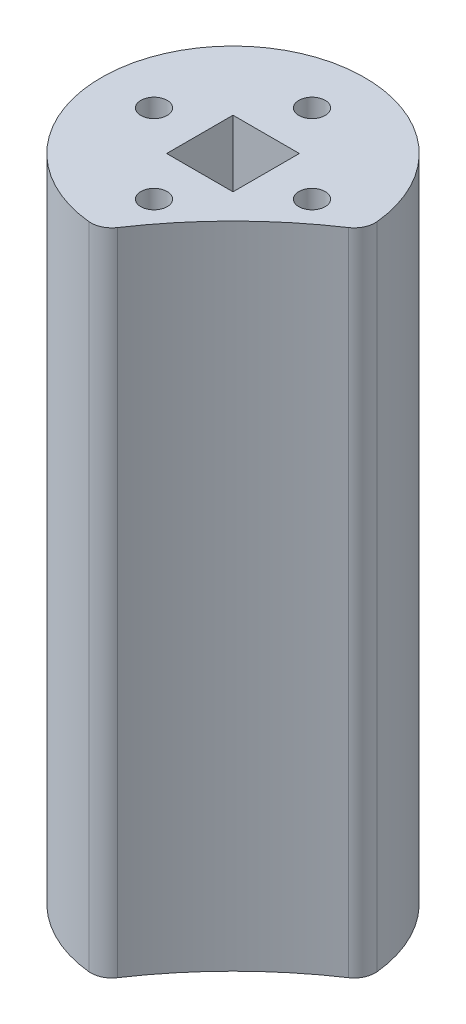
ISO-10303-21;
HEADER;
FILE_DESCRIPTION(('STEP AP214'),'2;1');
FILE_NAME('part.step','',(''),(''),'','','');
FILE_SCHEMA(('AUTOMOTIVE_DESIGN { 1 0 10303 214 1 1 1 1 }'));
ENDSEC;
DATA;
#1=APPLICATION_CONTEXT('core data for automotive mechanical design processes');
#2=APPLICATION_PROTOCOL_DEFINITION('international standard','automotive_design',2000,#1);
#3=PRODUCT_CONTEXT('',#1,'mechanical');
#4=PRODUCT('Part','Part','',(#3));
#5=PRODUCT_RELATED_PRODUCT_CATEGORY('part','',(#4));
#6=PRODUCT_DEFINITION_FORMATION('','',#4);
#7=PRODUCT_DEFINITION_CONTEXT('part definition',#1,'design');
#8=PRODUCT_DEFINITION('design','',#6,#7);
#9=PRODUCT_DEFINITION_SHAPE('','',#8);
#10=(LENGTH_UNIT() NAMED_UNIT(*) SI_UNIT(.MILLI.,.METRE.));
#11=(NAMED_UNIT(*) PLANE_ANGLE_UNIT() SI_UNIT($,.RADIAN.));
#12=(NAMED_UNIT(*) SI_UNIT($,.STERADIAN.) SOLID_ANGLE_UNIT());
#13=UNCERTAINTY_MEASURE_WITH_UNIT(LENGTH_MEASURE(1.E-05),#10,'distance_accuracy_value','');
#14=(GEOMETRIC_REPRESENTATION_CONTEXT(3) GLOBAL_UNCERTAINTY_ASSIGNED_CONTEXT((#13)) GLOBAL_UNIT_ASSIGNED_CONTEXT((#10,
#11,#12)) REPRESENTATION_CONTEXT('',''));
#15=CARTESIAN_POINT('',(0.,0.,0.));
#16=DIRECTION('',(0.,0.,1.));
#17=DIRECTION('',(1.,0.,0.));
#18=AXIS2_PLACEMENT_3D('',#15,#16,#17);
#19=CARTESIAN_POINT('',(0.,-61.675,-3.15));
#20=DIRECTION('',(0.,0.,1.));
#21=DIRECTION('',(1.,0.,0.));
#22=AXIS2_PLACEMENT_3D('',#19,#20,#21);
#23=PLANE('',#22);
#24=DIRECTION('',(1.,0.,0.));
#25=VECTOR('',#24,1.);
#26=CARTESIAN_POINT('',(0.,0.,-3.15));
#27=LINE('',#26,#25);
#28=CARTESIAN_POINT('',(-3.15,0.,-3.15));
#29=VERTEX_POINT('',#28);
#30=CARTESIAN_POINT('',(3.15,0.,-3.15));
#31=VERTEX_POINT('',#30);
#32=EDGE_CURVE('E153',#29,#31,#27,.T.);
#33=ORIENTED_EDGE('',*,*,#32,.F.);
#34=DIRECTION('',(0.,1.,0.));
#35=VECTOR('',#34,1.);
#36=CARTESIAN_POINT('',(-3.15,-61.675,-3.15));
#37=LINE('',#36,#35);
#38=CARTESIAN_POINT('',(-3.15,-61.675,-3.15));
#39=VERTEX_POINT('',#38);
#40=EDGE_CURVE('E130',#39,#29,#37,.T.);
#41=ORIENTED_EDGE('',*,*,#40,.F.);
#42=DIRECTION('',(1.,0.,0.));
#43=VECTOR('',#42,1.);
#44=CARTESIAN_POINT('',(0.,-61.675,-3.15));
#45=LINE('',#44,#43);
#46=CARTESIAN_POINT('',(3.15,-61.675,-3.15));
#47=VERTEX_POINT('',#46);
#48=EDGE_CURVE('E125',#39,#47,#45,.T.);
#49=ORIENTED_EDGE('',*,*,#48,.T.);
#50=DIRECTION('',(0.,1.,0.));
#51=VECTOR('',#50,1.);
#52=CARTESIAN_POINT('',(3.15,-61.675,-3.15));
#53=LINE('',#52,#51);
#54=EDGE_CURVE('E107',#47,#31,#53,.T.);
#55=ORIENTED_EDGE('',*,*,#54,.T.);
#56=EDGE_LOOP('',(#33,#41,#49,#55));
#57=FACE_BOUND('',#56,.T.);
#58=ADVANCED_FACE('F41',(#57),#23,.T.);
#59=CARTESIAN_POINT('',(-3.15,-61.675,0.));
#60=DIRECTION('',(-1.,0.,0.));
#61=DIRECTION('',(0.,0.,1.));
#62=AXIS2_PLACEMENT_3D('',#59,#60,#61);
#63=PLANE('',#62);
#64=DIRECTION('',(0.,0.,1.));
#65=VECTOR('',#64,1.);
#66=CARTESIAN_POINT('',(-3.15,0.,0.));
#67=LINE('',#66,#65);
#68=CARTESIAN_POINT('',(-3.15,0.,3.15));
#69=VERTEX_POINT('',#68);
#70=EDGE_CURVE('E162',#29,#69,#67,.T.);
#71=ORIENTED_EDGE('',*,*,#70,.T.);
#72=DIRECTION('',(0.,1.,0.));
#73=VECTOR('',#72,1.);
#74=CARTESIAN_POINT('',(-3.15,-61.675,3.15));
#75=LINE('',#74,#73);
#76=CARTESIAN_POINT('',(-3.15,-61.675,3.15));
#77=VERTEX_POINT('',#76);
#78=EDGE_CURVE('E169',#77,#69,#75,.T.);
#79=ORIENTED_EDGE('',*,*,#78,.F.);
#80=DIRECTION('',(0.,0.,1.));
#81=VECTOR('',#80,1.);
#82=CARTESIAN_POINT('',(-3.15,-61.675,0.));
#83=LINE('',#82,#81);
#84=EDGE_CURVE('E119',#39,#77,#83,.T.);
#85=ORIENTED_EDGE('',*,*,#84,.F.);
#86=ORIENTED_EDGE('',*,*,#40,.T.);
#87=EDGE_LOOP('',(#71,#79,#85,#86));
#88=FACE_BOUND('',#87,.T.);
#89=ADVANCED_FACE('F267',(#88),#63,.F.);
#90=CARTESIAN_POINT('',(0.,-61.675,3.15));
#91=DIRECTION('',(0.,0.,1.));
#92=DIRECTION('',(1.,0.,0.));
#93=AXIS2_PLACEMENT_3D('',#90,#91,#92);
#94=PLANE('',#93);
#95=DIRECTION('',(1.,0.,0.));
#96=VECTOR('',#95,1.);
#97=CARTESIAN_POINT('',(0.,0.,3.15));
#98=LINE('',#97,#96);
#99=CARTESIAN_POINT('',(3.15,0.,3.15));
#100=VERTEX_POINT('',#99);
#101=EDGE_CURVE('E158',#69,#100,#98,.T.);
#102=ORIENTED_EDGE('',*,*,#101,.T.);
#103=DIRECTION('',(0.,1.,0.));
#104=VECTOR('',#103,1.);
#105=CARTESIAN_POINT('',(3.15,-61.675,3.15));
#106=LINE('',#105,#104);
#107=CARTESIAN_POINT('',(3.15,-61.675,3.15));
#108=VERTEX_POINT('',#107);
#109=EDGE_CURVE('E118',#108,#100,#106,.T.);
#110=ORIENTED_EDGE('',*,*,#109,.F.);
#111=DIRECTION('',(1.,0.,0.));
#112=VECTOR('',#111,1.);
#113=CARTESIAN_POINT('',(0.,-61.675,3.15));
#114=LINE('',#113,#112);
#115=EDGE_CURVE('E126',#77,#108,#114,.T.);
#116=ORIENTED_EDGE('',*,*,#115,.F.);
#117=ORIENTED_EDGE('',*,*,#78,.T.);
#118=EDGE_LOOP('',(#102,#110,#116,#117));
#119=FACE_BOUND('',#118,.T.);
#120=ADVANCED_FACE('F272',(#119),#94,.F.);
#121=CARTESIAN_POINT('',(33.8350956133924,-61.675,33.8350956133924));
#122=DIRECTION('',(0.,1.,0.));
#123=DIRECTION('',(0.,0.,1.));
#124=AXIS2_PLACEMENT_3D('',#121,#122,#123);
#125=CYLINDRICAL_SURFACE('',#124,40.);
#126=CARTESIAN_POINT('',(33.8350956133924,-61.675,33.8350956133924));
#127=DIRECTION('',(0.,1.,0.));
#128=DIRECTION('',(0.,0.,1.));
#129=AXIS2_PLACEMENT_3D('',#126,#127,#128);
#130=CIRCLE('',#129,40.);
#131=CARTESIAN_POINT('',(11.5610124398885,-61.675,0.61062844264858));
#132=VERTEX_POINT('',#131);
#133=CARTESIAN_POINT('',(0.61062844264858,-61.675,11.5610124398885));
#134=VERTEX_POINT('',#133);
#135=EDGE_CURVE('E136',#132,#134,#130,.T.);
#136=ORIENTED_EDGE('',*,*,#135,.F.);
#137=DIRECTION('',(0.,1.,0.));
#138=VECTOR('',#137,1.);
#139=CARTESIAN_POINT('',(11.5610124398885,-61.675,0.61062844264858));
#140=LINE('',#139,#138);
#141=CARTESIAN_POINT('',(11.5610124398885,0.,0.61062844264858));
#142=VERTEX_POINT('',#141);
#143=EDGE_CURVE('E177',#132,#142,#140,.T.);
#144=ORIENTED_EDGE('',*,*,#143,.T.);
#145=CARTESIAN_POINT('',(33.8350956133924,0.,33.8350956133924));
#146=DIRECTION('',(0.,1.,0.));
#147=DIRECTION('',(0.,0.,1.));
#148=AXIS2_PLACEMENT_3D('',#145,#146,#147);
#149=CIRCLE('',#148,40.);
#150=CARTESIAN_POINT('',(0.61062844264858,0.,11.5610124398885));
#151=VERTEX_POINT('',#150);
#152=EDGE_CURVE('E144',#142,#151,#149,.T.);
#153=ORIENTED_EDGE('',*,*,#152,.T.);
#154=DIRECTION('',(0.,1.,0.));
#155=VECTOR('',#154,1.);
#156=CARTESIAN_POINT('',(0.61062844264858,-61.675,11.5610124398885));
#157=LINE('',#156,#155);
#158=EDGE_CURVE('E168',#151,#134,#157,.F.);
#159=ORIENTED_EDGE('',*,*,#158,.T.);
#160=EDGE_LOOP('',(#136,#144,#153,#159));
#161=FACE_BOUND('',#160,.T.);
#162=ADVANCED_FACE('F206',(#161),#125,.F.);
#163=CARTESIAN_POINT('',(0.,-61.675,0.));
#164=DIRECTION('',(0.,1.,0.));
#165=DIRECTION('',(0.,0.,1.));
#166=AXIS2_PLACEMENT_3D('',#163,#164,#165);
#167=CYLINDRICAL_SURFACE('',#166,12.5);
#168=CARTESIAN_POINT('',(0.,0.,0.));
#169=DIRECTION('',(0.,1.,0.));
#170=DIRECTION('',(0.,0.,1.));
#171=AXIS2_PLACEMENT_3D('',#168,#169,#170);
#172=CIRCLE('',#171,12.5);
#173=CARTESIAN_POINT('',(12.4372717633492,0.,-1.25070823320072));
#174=VERTEX_POINT('',#173);
#175=CARTESIAN_POINT('',(-1.25070823320073,0.,12.4372717633492));
#176=VERTEX_POINT('',#175);
#177=EDGE_CURVE('E148',#174,#176,#172,.T.);
#178=ORIENTED_EDGE('',*,*,#177,.F.);
#179=DIRECTION('',(0.,1.,0.));
#180=VECTOR('',#179,1.);
#181=CARTESIAN_POINT('',(12.4372717633492,-61.675,-1.25070823320072));
#182=LINE('',#181,#180);
#183=CARTESIAN_POINT('',(12.4372717633492,-61.675,-1.25070823320072));
#184=VERTEX_POINT('',#183);
#185=EDGE_CURVE('E63',#174,#184,#182,.F.);
#186=ORIENTED_EDGE('',*,*,#185,.T.);
#187=CARTESIAN_POINT('',(0.,-61.675,0.));
#188=DIRECTION('',(0.,1.,0.));
#189=DIRECTION('',(0.,0.,1.));
#190=AXIS2_PLACEMENT_3D('',#187,#188,#189);
#191=CIRCLE('',#190,12.5);
#192=CARTESIAN_POINT('',(-1.25070823320073,-61.675,12.4372717633492));
#193=VERTEX_POINT('',#192);
#194=EDGE_CURVE('E133',#184,#193,#191,.T.);
#195=ORIENTED_EDGE('',*,*,#194,.T.);
#196=DIRECTION('',(0.,1.,0.));
#197=VECTOR('',#196,1.);
#198=CARTESIAN_POINT('',(-1.25070823320073,-61.675,12.4372717633492));
#199=LINE('',#198,#197);
#200=EDGE_CURVE('E187',#193,#176,#199,.T.);
#201=ORIENTED_EDGE('',*,*,#200,.T.);
#202=EDGE_LOOP('',(#178,#186,#195,#201));
#203=FACE_BOUND('',#202,.T.);
#204=ADVANCED_FACE('F194',(#203),#167,.T.);
#205=CARTESIAN_POINT('',(3.15,-61.675,0.));
#206=DIRECTION('',(-1.,0.,0.));
#207=DIRECTION('',(0.,0.,1.));
#208=AXIS2_PLACEMENT_3D('',#205,#206,#207);
#209=PLANE('',#208);
#210=DIRECTION('',(0.,0.,1.));
#211=VECTOR('',#210,1.);
#212=CARTESIAN_POINT('',(3.15,0.,0.));
#213=LINE('',#212,#211);
#214=EDGE_CURVE('E112',#31,#100,#213,.T.);
#215=ORIENTED_EDGE('',*,*,#214,.F.);
#216=ORIENTED_EDGE('',*,*,#54,.F.);
#217=DIRECTION('',(0.,0.,1.));
#218=VECTOR('',#217,1.);
#219=CARTESIAN_POINT('',(3.15,-61.675,0.));
#220=LINE('',#219,#218);
#221=EDGE_CURVE('E110',#47,#108,#220,.T.);
#222=ORIENTED_EDGE('',*,*,#221,.T.);
#223=ORIENTED_EDGE('',*,*,#109,.T.);
#224=EDGE_LOOP('',(#215,#216,#222,#223));
#225=FACE_BOUND('',#224,.T.);
#226=ADVANCED_FACE('F109',(#225),#209,.T.);
#227=CARTESIAN_POINT('',(0.,-61.675,0.));
#228=DIRECTION('',(0.,1.,0.));
#229=DIRECTION('',(0.,0.,1.));
#230=AXIS2_PLACEMENT_3D('',#227,#228,#229);
#231=PLANE('',#230);
#232=CARTESIAN_POINT('',(0.,-61.675,-7.5));
#233=DIRECTION('',(0.,1.,0.));
#234=DIRECTION('',(0.,0.,1.));
#235=AXIS2_PLACEMENT_3D('',#232,#233,#234);
#236=CIRCLE('',#235,1.24999999999999);
#237=CARTESIAN_POINT('',(0.,-61.675,-6.25000000000001));
#238=VERTEX_POINT('',#237);
#239=EDGE_CURVE('E233',#238,#238,#236,.T.);
#240=ORIENTED_EDGE('',*,*,#239,.T.);
#241=EDGE_LOOP('',(#240));
#242=FACE_BOUND('',#241,.T.);
#243=CARTESIAN_POINT('',(7.5,-61.675,0.));
#244=DIRECTION('',(0.,1.,0.));
#245=DIRECTION('',(0.,0.,1.));
#246=AXIS2_PLACEMENT_3D('',#243,#244,#245);
#247=CIRCLE('',#246,1.24999999999999);
#248=CARTESIAN_POINT('',(7.5,-61.675,1.24999999999999));
#249=VERTEX_POINT('',#248);
#250=EDGE_CURVE('E225',#249,#249,#247,.T.);
#251=ORIENTED_EDGE('',*,*,#250,.T.);
#252=EDGE_LOOP('',(#251));
#253=FACE_BOUND('',#252,.T.);
#254=CARTESIAN_POINT('',(-7.5,-61.675,0.));
#255=DIRECTION('',(0.,1.,0.));
#256=DIRECTION('',(0.,0.,1.));
#257=AXIS2_PLACEMENT_3D('',#254,#255,#256);
#258=CIRCLE('',#257,1.24999999999999);
#259=CARTESIAN_POINT('',(-7.5,-61.675,1.24999999999999));
#260=VERTEX_POINT('',#259);
#261=EDGE_CURVE('E217',#260,#260,#258,.T.);
#262=ORIENTED_EDGE('',*,*,#261,.T.);
#263=EDGE_LOOP('',(#262));
#264=FACE_BOUND('',#263,.T.);
#265=CARTESIAN_POINT('',(0.,-61.675,7.5));
#266=DIRECTION('',(0.,1.,0.));
#267=DIRECTION('',(0.,0.,1.));
#268=AXIS2_PLACEMENT_3D('',#265,#266,#267);
#269=CIRCLE('',#268,1.24999999999999);
#270=CARTESIAN_POINT('',(0.,-61.675,8.74999999999999));
#271=VERTEX_POINT('',#270);
#272=EDGE_CURVE('E149',#271,#271,#269,.T.);
#273=ORIENTED_EDGE('',*,*,#272,.T.);
#274=EDGE_LOOP('',(#273));
#275=FACE_BOUND('',#274,.T.);
#276=ORIENTED_EDGE('',*,*,#194,.F.);
#277=CARTESIAN_POINT('',(10.4473082812133,-61.675,-1.05059491588861));
#278=DIRECTION('',(0.,1.,0.));
#279=DIRECTION('',(0.,0.,1.));
#280=AXIS2_PLACEMENT_3D('',#277,#278,#279);
#281=CIRCLE('',#280,2.);
#282=EDGE_CURVE('E11',#184,#132,#281,.F.);
#283=ORIENTED_EDGE('',*,*,#282,.T.);
#284=ORIENTED_EDGE('',*,*,#135,.T.);
#285=CARTESIAN_POINT('',(-1.05059491588861,-61.675,10.4473082812134));
#286=DIRECTION('',(0.,1.,0.));
#287=DIRECTION('',(0.,0.,1.));
#288=AXIS2_PLACEMENT_3D('',#285,#286,#287);
#289=CIRCLE('',#288,2.);
#290=EDGE_CURVE('E50',#134,#193,#289,.F.);
#291=ORIENTED_EDGE('',*,*,#290,.T.);
#292=EDGE_LOOP('',(#276,#283,#284,#291));
#293=FACE_BOUND('',#292,.T.);
#294=ORIENTED_EDGE('',*,*,#48,.F.);
#295=ORIENTED_EDGE('',*,*,#84,.T.);
#296=ORIENTED_EDGE('',*,*,#115,.T.);
#297=ORIENTED_EDGE('',*,*,#221,.F.);
#298=EDGE_LOOP('',(#294,#295,#296,#297));
#299=FACE_BOUND('',#298,.T.);
#300=ADVANCED_FACE('F123',(#242,#253,#264,#275,#293,#299),#231,.F.);
#301=CARTESIAN_POINT('',(0.,0.,0.));
#302=DIRECTION('',(0.,1.,0.));
#303=DIRECTION('',(0.,0.,1.));
#304=AXIS2_PLACEMENT_3D('',#301,#302,#303);
#305=PLANE('',#304);
#306=CARTESIAN_POINT('',(0.,0.,-7.5));
#307=DIRECTION('',(0.,1.,0.));
#308=DIRECTION('',(0.,0.,1.));
#309=AXIS2_PLACEMENT_3D('',#306,#307,#308);
#310=CIRCLE('',#309,1.25);
#311=CARTESIAN_POINT('',(0.,0.,-6.25));
#312=VERTEX_POINT('',#311);
#313=EDGE_CURVE('E237',#312,#312,#310,.T.);
#314=ORIENTED_EDGE('',*,*,#313,.F.);
#315=EDGE_LOOP('',(#314));
#316=FACE_BOUND('',#315,.T.);
#317=CARTESIAN_POINT('',(7.5,0.,0.));
#318=DIRECTION('',(0.,1.,0.));
#319=DIRECTION('',(0.,0.,1.));
#320=AXIS2_PLACEMENT_3D('',#317,#318,#319);
#321=CIRCLE('',#320,1.25);
#322=CARTESIAN_POINT('',(7.5,0.,1.25));
#323=VERTEX_POINT('',#322);
#324=EDGE_CURVE('E229',#323,#323,#321,.T.);
#325=ORIENTED_EDGE('',*,*,#324,.F.);
#326=EDGE_LOOP('',(#325));
#327=FACE_BOUND('',#326,.T.);
#328=CARTESIAN_POINT('',(-7.5,0.,0.));
#329=DIRECTION('',(0.,1.,0.));
#330=DIRECTION('',(0.,0.,1.));
#331=AXIS2_PLACEMENT_3D('',#328,#329,#330);
#332=CIRCLE('',#331,1.25);
#333=CARTESIAN_POINT('',(-7.5,0.,1.25));
#334=VERTEX_POINT('',#333);
#335=EDGE_CURVE('E221',#334,#334,#332,.T.);
#336=ORIENTED_EDGE('',*,*,#335,.F.);
#337=EDGE_LOOP('',(#336));
#338=FACE_BOUND('',#337,.T.);
#339=CARTESIAN_POINT('',(0.,0.,7.5));
#340=DIRECTION('',(0.,1.,0.));
#341=DIRECTION('',(0.,0.,1.));
#342=AXIS2_PLACEMENT_3D('',#339,#340,#341);
#343=CIRCLE('',#342,1.25);
#344=CARTESIAN_POINT('',(0.,0.,8.75));
#345=VERTEX_POINT('',#344);
#346=EDGE_CURVE('E213',#345,#345,#343,.T.);
#347=ORIENTED_EDGE('',*,*,#346,.F.);
#348=EDGE_LOOP('',(#347));
#349=FACE_BOUND('',#348,.T.);
#350=ORIENTED_EDGE('',*,*,#152,.F.);
#351=CARTESIAN_POINT('',(10.4473082812133,0.,-1.05059491588861));
#352=DIRECTION('',(0.,1.,0.));
#353=DIRECTION('',(0.,0.,1.));
#354=AXIS2_PLACEMENT_3D('',#351,#352,#353);
#355=CIRCLE('',#354,2.);
#356=EDGE_CURVE('E184',#142,#174,#355,.T.);
#357=ORIENTED_EDGE('',*,*,#356,.T.);
#358=ORIENTED_EDGE('',*,*,#177,.T.);
#359=CARTESIAN_POINT('',(-1.05059491588861,0.,10.4473082812134));
#360=DIRECTION('',(0.,1.,0.));
#361=DIRECTION('',(0.,0.,1.));
#362=AXIS2_PLACEMENT_3D('',#359,#360,#361);
#363=CIRCLE('',#362,2.);
#364=EDGE_CURVE('E181',#176,#151,#363,.T.);
#365=ORIENTED_EDGE('',*,*,#364,.T.);
#366=EDGE_LOOP('',(#350,#357,#358,#365));
#367=FACE_BOUND('',#366,.T.);
#368=ORIENTED_EDGE('',*,*,#32,.T.);
#369=ORIENTED_EDGE('',*,*,#214,.T.);
#370=ORIENTED_EDGE('',*,*,#101,.F.);
#371=ORIENTED_EDGE('',*,*,#70,.F.);
#372=EDGE_LOOP('',(#368,#369,#370,#371));
#373=FACE_BOUND('',#372,.T.);
#374=ADVANCED_FACE('F198',(#316,#327,#338,#349,#367,#373),#305,.T.);
#375=CARTESIAN_POINT('',(0.,0.,7.5));
#376=DIRECTION('',(0.,1.,0.));
#377=DIRECTION('',(0.,0.,1.));
#378=AXIS2_PLACEMENT_3D('',#375,#376,#377);
#379=CYLINDRICAL_SURFACE('',#378,1.24999999999999);
#380=ORIENTED_EDGE('',*,*,#272,.F.);
#381=EDGE_LOOP('',(#380));
#382=FACE_BOUND('',#381,.T.);
#383=ORIENTED_EDGE('',*,*,#346,.T.);
#384=EDGE_LOOP('',(#383));
#385=FACE_BOUND('',#384,.T.);
#386=ADVANCED_FACE('F246',(#382,#385),#379,.F.);
#387=CARTESIAN_POINT('',(-7.5,0.,0.));
#388=DIRECTION('',(0.,1.,0.));
#389=DIRECTION('',(0.,0.,1.));
#390=AXIS2_PLACEMENT_3D('',#387,#388,#389);
#391=CYLINDRICAL_SURFACE('',#390,1.24999999999999);
#392=ORIENTED_EDGE('',*,*,#261,.F.);
#393=EDGE_LOOP('',(#392));
#394=FACE_BOUND('',#393,.T.);
#395=ORIENTED_EDGE('',*,*,#335,.T.);
#396=EDGE_LOOP('',(#395));
#397=FACE_BOUND('',#396,.T.);
#398=ADVANCED_FACE('F255',(#394,#397),#391,.F.);
#399=CARTESIAN_POINT('',(7.5,0.,0.));
#400=DIRECTION('',(0.,1.,0.));
#401=DIRECTION('',(0.,0.,1.));
#402=AXIS2_PLACEMENT_3D('',#399,#400,#401);
#403=CYLINDRICAL_SURFACE('',#402,1.24999999999999);
#404=ORIENTED_EDGE('',*,*,#250,.F.);
#405=EDGE_LOOP('',(#404));
#406=FACE_BOUND('',#405,.T.);
#407=ORIENTED_EDGE('',*,*,#324,.T.);
#408=EDGE_LOOP('',(#407));
#409=FACE_BOUND('',#408,.T.);
#410=ADVANCED_FACE('F261',(#406,#409),#403,.F.);
#411=CARTESIAN_POINT('',(0.,0.,-7.5));
#412=DIRECTION('',(0.,1.,0.));
#413=DIRECTION('',(0.,0.,1.));
#414=AXIS2_PLACEMENT_3D('',#411,#412,#413);
#415=CYLINDRICAL_SURFACE('',#414,1.24999999999999);
#416=ORIENTED_EDGE('',*,*,#239,.F.);
#417=EDGE_LOOP('',(#416));
#418=FACE_BOUND('',#417,.T.);
#419=ORIENTED_EDGE('',*,*,#313,.T.);
#420=EDGE_LOOP('',(#419));
#421=FACE_BOUND('',#420,.T.);
#422=ADVANCED_FACE('F242',(#418,#421),#415,.F.);
#423=CARTESIAN_POINT('',(10.4473082812133,-61.675,-1.05059491588861));
#424=DIRECTION('',(0.,-1.,0.));
#425=DIRECTION('',(0.,0.,-1.));
#426=AXIS2_PLACEMENT_3D('',#423,#424,#425);
#427=CYLINDRICAL_SURFACE('',#426,2.);
#428=ORIENTED_EDGE('',*,*,#282,.F.);
#429=ORIENTED_EDGE('',*,*,#185,.F.);
#430=ORIENTED_EDGE('',*,*,#356,.F.);
#431=ORIENTED_EDGE('',*,*,#143,.F.);
#432=EDGE_LOOP('',(#428,#429,#430,#431));
#433=FACE_BOUND('',#432,.T.);
#434=ADVANCED_FACE('F203',(#433),#427,.T.);
#435=CARTESIAN_POINT('',(-1.05059491588861,-61.675,10.4473082812134));
#436=DIRECTION('',(0.,-1.,0.));
#437=DIRECTION('',(0.,0.,-1.));
#438=AXIS2_PLACEMENT_3D('',#435,#436,#437);
#439=CYLINDRICAL_SURFACE('',#438,2.);
#440=ORIENTED_EDGE('',*,*,#290,.F.);
#441=ORIENTED_EDGE('',*,*,#158,.F.);
#442=ORIENTED_EDGE('',*,*,#364,.F.);
#443=ORIENTED_EDGE('',*,*,#200,.F.);
#444=EDGE_LOOP('',(#440,#441,#442,#443));
#445=FACE_BOUND('',#444,.T.);
#446=ADVANCED_FACE('F43',(#445),#439,.T.);
#447=CLOSED_SHELL('',(#58,#89,#120,#162,#204,#226,#300,#374,#386,#398,#410,#422,#434,#446));
#448=MANIFOLD_SOLID_BREP('B2',#447);
#449=ADVANCED_BREP_SHAPE_REPRESENTATION('',(#18,#448),#14);
#450=SHAPE_DEFINITION_REPRESENTATION(#9,#449);
ENDSEC;
END-ISO-10303-21;
